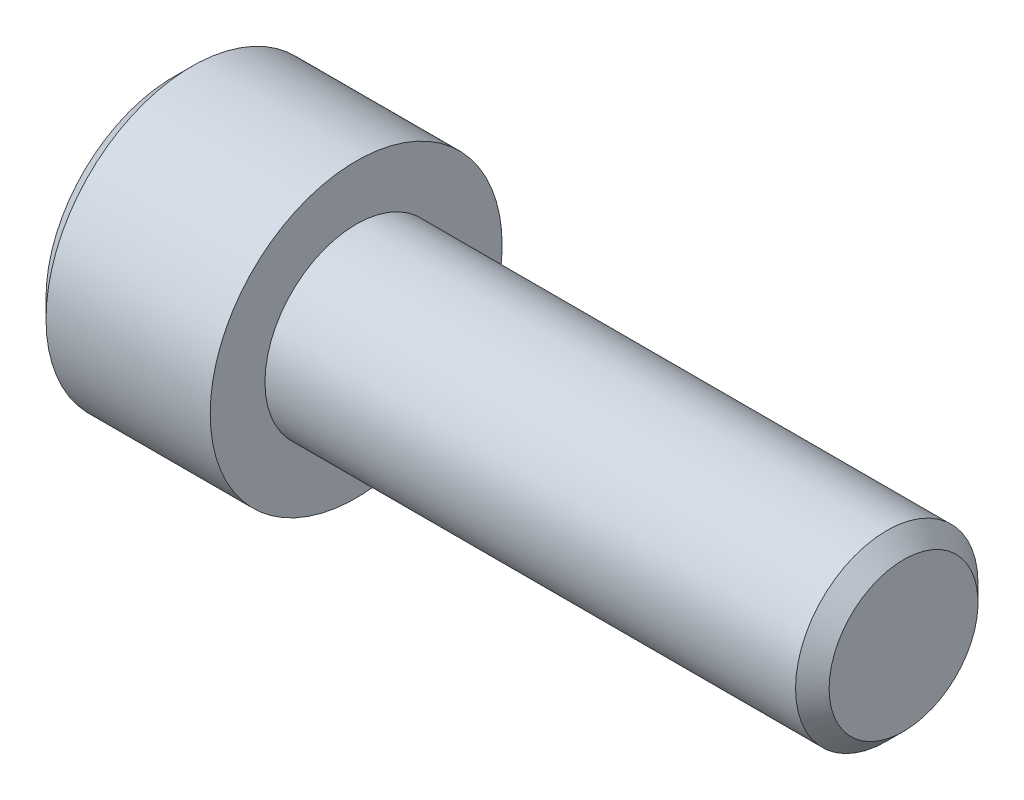
ISO-10303-21;
HEADER;
FILE_DESCRIPTION(('STEP AP214'),'2;1');
FILE_NAME('part.step','',(''),(''),'','','');
FILE_SCHEMA(('AUTOMOTIVE_DESIGN { 1 0 10303 214 1 1 1 1 }'));
ENDSEC;
DATA;
#1=APPLICATION_CONTEXT('core data for automotive mechanical design processes');
#2=APPLICATION_PROTOCOL_DEFINITION('international standard','automotive_design',2000,#1);
#3=PRODUCT_CONTEXT('',#1,'mechanical');
#4=PRODUCT('Part','Part','',(#3));
#5=PRODUCT_RELATED_PRODUCT_CATEGORY('part','',(#4));
#6=PRODUCT_DEFINITION_FORMATION('','',#4);
#7=PRODUCT_DEFINITION_CONTEXT('part definition',#1,'design');
#8=PRODUCT_DEFINITION('design','',#6,#7);
#9=PRODUCT_DEFINITION_SHAPE('','',#8);
#10=(LENGTH_UNIT() NAMED_UNIT(*) SI_UNIT(.MILLI.,.METRE.));
#11=(NAMED_UNIT(*) PLANE_ANGLE_UNIT() SI_UNIT($,.RADIAN.));
#12=(NAMED_UNIT(*) SI_UNIT($,.STERADIAN.) SOLID_ANGLE_UNIT());
#13=UNCERTAINTY_MEASURE_WITH_UNIT(LENGTH_MEASURE(1.E-05),#10,'distance_accuracy_value','');
#14=(GEOMETRIC_REPRESENTATION_CONTEXT(3) GLOBAL_UNCERTAINTY_ASSIGNED_CONTEXT((#13)) GLOBAL_UNIT_ASSIGNED_CONTEXT((#10,
#11,#12)) REPRESENTATION_CONTEXT('',''));
#15=CARTESIAN_POINT('',(0.,0.,0.));
#16=DIRECTION('',(0.,0.,1.));
#17=DIRECTION('',(1.,0.,0.));
#18=AXIS2_PLACEMENT_3D('',#15,#16,#17);
#19=CARTESIAN_POINT('',(-4.99999999993861,0.,0.));
#20=DIRECTION('',(-1.,0.,0.));
#21=DIRECTION('',(0.,0.,1.));
#22=AXIS2_PLACEMENT_3D('',#19,#20,#21);
#23=CONICAL_SURFACE('',#22,3.99999999984857,1.3089969389862);
#24=CARTESIAN_POINT('',(-3.92820323028786,0.,-5.6843418860808E-11));
#25=VERTEX_POINT('',#24);
#26=VERTEX_LOOP('',#25);
#27=FACE_BOUND('',#26,.T.);
#28=CARTESIAN_POINT('',(-4.99999999995384,0.,0.));
#29=DIRECTION('',(-1.,0.,0.));
#30=DIRECTION('',(0.,0.,1.));
#31=AXIS2_PLACEMENT_3D('',#28,#29,#30);
#32=CIRCLE('',#31,3.99999999990541);
#33=CARTESIAN_POINT('',(-4.99999999997692,3.46410161509679,-1.99999999997635));
#34=VERTEX_POINT('',#33);
#35=CARTESIAN_POINT('',(-4.99999999997692,0.,-3.99999999995271));
#36=VERTEX_POINT('',#35);
#37=EDGE_CURVE('E152',#34,#36,#32,.T.);
#38=ORIENTED_EDGE('',*,*,#37,.T.);
#39=CARTESIAN_POINT('',(-4.99999999995384,0.,0.));
#40=DIRECTION('',(-1.,0.,0.));
#41=DIRECTION('',(0.,0.,1.));
#42=AXIS2_PLACEMENT_3D('',#39,#40,#41);
#43=CIRCLE('',#42,3.99999999990541);
#44=CARTESIAN_POINT('',(-4.99999999997692,-3.4641016150968,-1.99999999997636));
#45=VERTEX_POINT('',#44);
#46=EDGE_CURVE('E136',#36,#45,#43,.T.);
#47=ORIENTED_EDGE('',*,*,#46,.T.);
#48=CARTESIAN_POINT('',(-4.99999999995384,0.,0.));
#49=DIRECTION('',(-1.,0.,0.));
#50=DIRECTION('',(0.,0.,1.));
#51=AXIS2_PLACEMENT_3D('',#48,#49,#50);
#52=CIRCLE('',#51,3.99999999990541);
#53=CARTESIAN_POINT('',(-4.99999999997692,-3.4641016150968,1.99999999997635));
#54=VERTEX_POINT('',#53);
#55=EDGE_CURVE('E89',#45,#54,#52,.T.);
#56=ORIENTED_EDGE('',*,*,#55,.T.);
#57=CARTESIAN_POINT('',(-4.99999999995384,0.,0.));
#58=DIRECTION('',(-1.,0.,0.));
#59=DIRECTION('',(0.,0.,1.));
#60=AXIS2_PLACEMENT_3D('',#57,#58,#59);
#61=CIRCLE('',#60,3.99999999990541);
#62=CARTESIAN_POINT('',(-4.99999999997692,0.,3.99999999995271));
#63=VERTEX_POINT('',#62);
#64=EDGE_CURVE('E20',#54,#63,#61,.T.);
#65=ORIENTED_EDGE('',*,*,#64,.T.);
#66=CARTESIAN_POINT('',(-4.99999999995384,0.,0.));
#67=DIRECTION('',(-1.,0.,0.));
#68=DIRECTION('',(0.,0.,1.));
#69=AXIS2_PLACEMENT_3D('',#66,#67,#68);
#70=CIRCLE('',#69,3.99999999990541);
#71=CARTESIAN_POINT('',(-4.99999999997692,3.4641016150968,1.99999999997636));
#72=VERTEX_POINT('',#71);
#73=EDGE_CURVE('E92',#63,#72,#70,.T.);
#74=ORIENTED_EDGE('',*,*,#73,.T.);
#75=CARTESIAN_POINT('',(-4.99999999995384,0.,0.));
#76=DIRECTION('',(-1.,0.,0.));
#77=DIRECTION('',(0.,0.,1.));
#78=AXIS2_PLACEMENT_3D('',#75,#76,#77);
#79=CIRCLE('',#78,3.99999999990541);
#80=EDGE_CURVE('E106',#72,#34,#79,.T.);
#81=ORIENTED_EDGE('',*,*,#80,.T.);
#82=EDGE_LOOP('',(#38,#47,#56,#65,#74,#81));
#83=FACE_BOUND('',#82,.T.);
#84=ADVANCED_FACE('F17',(#27,#83),#23,.F.);
#85=CARTESIAN_POINT('',(-5.,0.,0.));
#86=DIRECTION('',(1.,0.,0.));
#87=DIRECTION('',(0.,0.,-1.));
#88=AXIS2_PLACEMENT_3D('',#85,#86,#87);
#89=PLANE('',#88);
#90=DIRECTION('',(0.,0.5,0.866025403784439));
#91=VECTOR('',#90,1.);
#92=CARTESIAN_POINT('',(-5.,-2.3094010767585,4.));
#93=LINE('',#92,#91);
#94=CARTESIAN_POINT('',(-5.,-2.3094010767585,4.));
#95=VERTEX_POINT('',#94);
#96=EDGE_CURVE('E111',#95,#54,#93,.F.);
#97=ORIENTED_EDGE('',*,*,#96,.F.);
#98=DIRECTION('',(0.,1.,0.));
#99=VECTOR('',#98,1.);
#100=CARTESIAN_POINT('',(-5.,2.3094010767585,4.));
#101=LINE('',#100,#99);
#102=EDGE_CURVE('E108',#63,#95,#101,.F.);
#103=ORIENTED_EDGE('',*,*,#102,.F.);
#104=ORIENTED_EDGE('',*,*,#64,.F.);
#105=EDGE_LOOP('',(#97,#103,#104));
#106=FACE_BOUND('',#105,.T.);
#107=ADVANCED_FACE('F109',(#106),#89,.F.);
#108=CARTESIAN_POINT('',(-5.,0.,0.));
#109=DIRECTION('',(1.,0.,0.));
#110=DIRECTION('',(0.,0.,-1.));
#111=AXIS2_PLACEMENT_3D('',#108,#109,#110);
#112=PLANE('',#111);
#113=DIRECTION('',(0.,1.,0.));
#114=VECTOR('',#113,1.);
#115=CARTESIAN_POINT('',(-5.,2.3094010767585,4.));
#116=LINE('',#115,#114);
#117=CARTESIAN_POINT('',(-5.,2.3094010767585,4.));
#118=VERTEX_POINT('',#117);
#119=EDGE_CURVE('E101',#118,#63,#116,.F.);
#120=ORIENTED_EDGE('',*,*,#119,.F.);
#121=DIRECTION('',(0.,0.5,-0.866025403784439));
#122=VECTOR('',#121,1.);
#123=CARTESIAN_POINT('',(-5.,4.61880215351701,0.));
#124=LINE('',#123,#122);
#125=EDGE_CURVE('E104',#72,#118,#124,.F.);
#126=ORIENTED_EDGE('',*,*,#125,.F.);
#127=ORIENTED_EDGE('',*,*,#73,.F.);
#128=EDGE_LOOP('',(#120,#126,#127));
#129=FACE_BOUND('',#128,.T.);
#130=ADVANCED_FACE('F99',(#129),#112,.F.);
#131=CARTESIAN_POINT('',(-5.,0.,0.));
#132=DIRECTION('',(1.,0.,0.));
#133=DIRECTION('',(0.,0.,-1.));
#134=AXIS2_PLACEMENT_3D('',#131,#132,#133);
#135=PLANE('',#134);
#136=ORIENTED_EDGE('',*,*,#80,.F.);
#137=DIRECTION('',(0.,0.5,-0.866025403784439));
#138=VECTOR('',#137,1.);
#139=CARTESIAN_POINT('',(-5.,4.61880215351701,0.));
#140=LINE('',#139,#138);
#141=CARTESIAN_POINT('',(-5.,4.61880215351701,0.));
#142=VERTEX_POINT('',#141);
#143=EDGE_CURVE('E132',#142,#72,#140,.F.);
#144=ORIENTED_EDGE('',*,*,#143,.F.);
#145=DIRECTION('',(0.,-0.5,-0.866025403784439));
#146=VECTOR('',#145,1.);
#147=CARTESIAN_POINT('',(-5.,2.3094010767585,-4.));
#148=LINE('',#147,#146);
#149=EDGE_CURVE('E168',#34,#142,#148,.F.);
#150=ORIENTED_EDGE('',*,*,#149,.F.);
#151=EDGE_LOOP('',(#136,#144,#150));
#152=FACE_BOUND('',#151,.T.);
#153=ADVANCED_FACE('F169',(#152),#135,.F.);
#154=CARTESIAN_POINT('',(-5.,0.,0.));
#155=DIRECTION('',(1.,0.,0.));
#156=DIRECTION('',(0.,0.,-1.));
#157=AXIS2_PLACEMENT_3D('',#154,#155,#156);
#158=PLANE('',#157);
#159=DIRECTION('',(0.,-0.5,-0.866025403784439));
#160=VECTOR('',#159,1.);
#161=CARTESIAN_POINT('',(-5.,2.3094010767585,-4.));
#162=LINE('',#161,#160);
#163=CARTESIAN_POINT('',(-5.,2.3094010767585,-4.));
#164=VERTEX_POINT('',#163);
#165=EDGE_CURVE('E162',#164,#34,#162,.F.);
#166=ORIENTED_EDGE('',*,*,#165,.F.);
#167=DIRECTION('',(0.,1.,0.));
#168=VECTOR('',#167,1.);
#169=CARTESIAN_POINT('',(-5.,-2.3094010767585,-4.));
#170=LINE('',#169,#168);
#171=EDGE_CURVE('E165',#36,#164,#170,.T.);
#172=ORIENTED_EDGE('',*,*,#171,.F.);
#173=ORIENTED_EDGE('',*,*,#37,.F.);
#174=EDGE_LOOP('',(#166,#172,#173));
#175=FACE_BOUND('',#174,.T.);
#176=ADVANCED_FACE('F160',(#175),#158,.F.);
#177=CARTESIAN_POINT('',(-5.,0.,0.));
#178=DIRECTION('',(1.,0.,0.));
#179=DIRECTION('',(0.,0.,-1.));
#180=AXIS2_PLACEMENT_3D('',#177,#178,#179);
#181=PLANE('',#180);
#182=DIRECTION('',(0.,-0.5,0.866025403784439));
#183=VECTOR('',#182,1.);
#184=CARTESIAN_POINT('',(-5.,-4.61880215351701,0.));
#185=LINE('',#184,#183);
#186=CARTESIAN_POINT('',(-5.,-4.61880215351701,0.));
#187=VERTEX_POINT('',#186);
#188=EDGE_CURVE('E214',#187,#45,#185,.F.);
#189=ORIENTED_EDGE('',*,*,#188,.F.);
#190=DIRECTION('',(0.,0.5,0.866025403784439));
#191=VECTOR('',#190,1.);
#192=CARTESIAN_POINT('',(-5.,-2.3094010767585,4.));
#193=LINE('',#192,#191);
#194=EDGE_CURVE('E120',#54,#187,#193,.F.);
#195=ORIENTED_EDGE('',*,*,#194,.F.);
#196=ORIENTED_EDGE('',*,*,#55,.F.);
#197=EDGE_LOOP('',(#189,#195,#196));
#198=FACE_BOUND('',#197,.T.);
#199=ADVANCED_FACE('F253',(#198),#181,.F.);
#200=CARTESIAN_POINT('',(-5.,0.,0.));
#201=DIRECTION('',(1.,0.,0.));
#202=DIRECTION('',(0.,0.,-1.));
#203=AXIS2_PLACEMENT_3D('',#200,#201,#202);
#204=PLANE('',#203);
#205=DIRECTION('',(0.,1.,0.));
#206=VECTOR('',#205,1.);
#207=CARTESIAN_POINT('',(-5.,-2.3094010767585,-4.));
#208=LINE('',#207,#206);
#209=CARTESIAN_POINT('',(-5.,-2.3094010767585,-4.));
#210=VERTEX_POINT('',#209);
#211=EDGE_CURVE('E187',#210,#36,#208,.T.);
#212=ORIENTED_EDGE('',*,*,#211,.F.);
#213=DIRECTION('',(0.,-0.5,0.866025403784439));
#214=VECTOR('',#213,1.);
#215=CARTESIAN_POINT('',(-5.,-4.61880215351701,0.));
#216=LINE('',#215,#214);
#217=EDGE_CURVE('E217',#45,#210,#216,.F.);
#218=ORIENTED_EDGE('',*,*,#217,.F.);
#219=ORIENTED_EDGE('',*,*,#46,.F.);
#220=EDGE_LOOP('',(#212,#218,#219));
#221=FACE_BOUND('',#220,.T.);
#222=ADVANCED_FACE('F250',(#221),#204,.F.);
#223=CARTESIAN_POINT('',(-5.,-2.3094010767585,4.));
#224=DIRECTION('',(0.,0.866025403784439,-0.5));
#225=DIRECTION('',(0.,0.5,0.866025403784439));
#226=AXIS2_PLACEMENT_3D('',#223,#224,#225);
#227=PLANE('',#226);
#228=ORIENTED_EDGE('',*,*,#194,.T.);
#229=DIRECTION('',(1.,0.,0.));
#230=VECTOR('',#229,1.);
#231=CARTESIAN_POINT('',(-5.,-4.61880215351701,0.));
#232=LINE('',#231,#230);
#233=CARTESIAN_POINT('',(-10.,-4.61880215351701,0.));
#234=VERTEX_POINT('',#233);
#235=EDGE_CURVE('E218',#234,#187,#232,.T.);
#236=ORIENTED_EDGE('',*,*,#235,.F.);
#237=DIRECTION('',(0.,0.500000000000001,0.866025403784438));
#238=VECTOR('',#237,1.);
#239=CARTESIAN_POINT('',(-10.,-4.61880215351701,0.));
#240=LINE('',#239,#238);
#241=CARTESIAN_POINT('',(-10.,-2.3094010767585,4.));
#242=VERTEX_POINT('',#241);
#243=EDGE_CURVE('E213',#234,#242,#240,.T.);
#244=ORIENTED_EDGE('',*,*,#243,.T.);
#245=DIRECTION('',(-1.,0.,0.));
#246=VECTOR('',#245,1.);
#247=CARTESIAN_POINT('',(-5.,-2.3094010767585,4.));
#248=LINE('',#247,#246);
#249=EDGE_CURVE('E115',#95,#242,#248,.T.);
#250=ORIENTED_EDGE('',*,*,#249,.F.);
#251=ORIENTED_EDGE('',*,*,#96,.T.);
#252=EDGE_LOOP('',(#228,#236,#244,#250,#251));
#253=FACE_BOUND('',#252,.T.);
#254=ADVANCED_FACE('F255',(#253),#227,.T.);
#255=CARTESIAN_POINT('',(-5.,2.3094010767585,4.));
#256=DIRECTION('',(0.,0.,-1.));
#257=DIRECTION('',(-1.,0.,0.));
#258=AXIS2_PLACEMENT_3D('',#255,#256,#257);
#259=PLANE('',#258);
#260=ORIENTED_EDGE('',*,*,#102,.T.);
#261=ORIENTED_EDGE('',*,*,#249,.T.);
#262=DIRECTION('',(0.,1.,0.));
#263=VECTOR('',#262,1.);
#264=CARTESIAN_POINT('',(-10.,0.,4.));
#265=LINE('',#264,#263);
#266=CARTESIAN_POINT('',(-10.,2.3094010767585,4.));
#267=VERTEX_POINT('',#266);
#268=EDGE_CURVE('E208',#242,#267,#265,.T.);
#269=ORIENTED_EDGE('',*,*,#268,.T.);
#270=DIRECTION('',(1.,0.,0.));
#271=VECTOR('',#270,1.);
#272=CARTESIAN_POINT('',(-5.,2.30940107675851,4.));
#273=LINE('',#272,#271);
#274=EDGE_CURVE('E119',#118,#267,#273,.F.);
#275=ORIENTED_EDGE('',*,*,#274,.F.);
#276=ORIENTED_EDGE('',*,*,#119,.T.);
#277=EDGE_LOOP('',(#260,#261,#269,#275,#276));
#278=FACE_BOUND('',#277,.T.);
#279=ADVANCED_FACE('F117',(#278),#259,.T.);
#280=CARTESIAN_POINT('',(-5.,4.61880215351701,0.));
#281=DIRECTION('',(0.,-0.866025403784439,-0.5));
#282=DIRECTION('',(0.,0.5,-0.866025403784439));
#283=AXIS2_PLACEMENT_3D('',#280,#281,#282);
#284=PLANE('',#283);
#285=ORIENTED_EDGE('',*,*,#125,.T.);
#286=ORIENTED_EDGE('',*,*,#274,.T.);
#287=DIRECTION('',(0.,0.500000000000001,-0.866025403784438));
#288=VECTOR('',#287,1.);
#289=CARTESIAN_POINT('',(-10.,2.3094010767585,4.));
#290=LINE('',#289,#288);
#291=CARTESIAN_POINT('',(-10.,4.61880215351701,0.));
#292=VERTEX_POINT('',#291);
#293=EDGE_CURVE('E198',#267,#292,#290,.T.);
#294=ORIENTED_EDGE('',*,*,#293,.T.);
#295=DIRECTION('',(1.,0.,0.));
#296=VECTOR('',#295,1.);
#297=CARTESIAN_POINT('',(-5.,4.618802153517,0.));
#298=LINE('',#297,#296);
#299=EDGE_CURVE('E173',#142,#292,#298,.F.);
#300=ORIENTED_EDGE('',*,*,#299,.F.);
#301=ORIENTED_EDGE('',*,*,#143,.T.);
#302=EDGE_LOOP('',(#285,#286,#294,#300,#301));
#303=FACE_BOUND('',#302,.T.);
#304=ADVANCED_FACE('F196',(#303),#284,.T.);
#305=CARTESIAN_POINT('',(-5.,2.3094010767585,-4.));
#306=DIRECTION('',(0.,-0.866025403784439,0.5));
#307=DIRECTION('',(0.,-0.5,-0.866025403784439));
#308=AXIS2_PLACEMENT_3D('',#305,#306,#307);
#309=PLANE('',#308);
#310=ORIENTED_EDGE('',*,*,#149,.T.);
#311=ORIENTED_EDGE('',*,*,#299,.T.);
#312=DIRECTION('',(0.,-0.500000000000001,-0.866025403784438));
#313=VECTOR('',#312,1.);
#314=CARTESIAN_POINT('',(-10.,4.61880215351701,0.));
#315=LINE('',#314,#313);
#316=CARTESIAN_POINT('',(-10.,2.3094010767585,-4.));
#317=VERTEX_POINT('',#316);
#318=EDGE_CURVE('E200',#292,#317,#315,.T.);
#319=ORIENTED_EDGE('',*,*,#318,.T.);
#320=DIRECTION('',(1.,0.,0.));
#321=VECTOR('',#320,1.);
#322=CARTESIAN_POINT('',(-5.,2.3094010767585,-4.));
#323=LINE('',#322,#321);
#324=EDGE_CURVE('E176',#164,#317,#323,.F.);
#325=ORIENTED_EDGE('',*,*,#324,.F.);
#326=ORIENTED_EDGE('',*,*,#165,.T.);
#327=EDGE_LOOP('',(#310,#311,#319,#325,#326));
#328=FACE_BOUND('',#327,.T.);
#329=ADVANCED_FACE('F175',(#328),#309,.T.);
#330=CARTESIAN_POINT('',(-5.,-2.3094010767585,-4.));
#331=DIRECTION('',(0.,0.,1.));
#332=DIRECTION('',(1.,0.,0.));
#333=AXIS2_PLACEMENT_3D('',#330,#331,#332);
#334=PLANE('',#333);
#335=ORIENTED_EDGE('',*,*,#171,.T.);
#336=ORIENTED_EDGE('',*,*,#324,.T.);
#337=DIRECTION('',(0.,1.,0.));
#338=VECTOR('',#337,1.);
#339=CARTESIAN_POINT('',(-10.,0.,-4.));
#340=LINE('',#339,#338);
#341=CARTESIAN_POINT('',(-10.,-2.3094010767585,-4.));
#342=VERTEX_POINT('',#341);
#343=EDGE_CURVE('E35',#317,#342,#340,.F.);
#344=ORIENTED_EDGE('',*,*,#343,.T.);
#345=DIRECTION('',(1.,0.,0.));
#346=VECTOR('',#345,1.);
#347=CARTESIAN_POINT('',(-5.,-2.30940107675851,-4.));
#348=LINE('',#347,#346);
#349=EDGE_CURVE('E223',#210,#342,#348,.F.);
#350=ORIENTED_EDGE('',*,*,#349,.F.);
#351=ORIENTED_EDGE('',*,*,#211,.T.);
#352=EDGE_LOOP('',(#335,#336,#344,#350,#351));
#353=FACE_BOUND('',#352,.T.);
#354=ADVANCED_FACE('F247',(#353),#334,.T.);
#355=CARTESIAN_POINT('',(-5.,-4.61880215351701,0.));
#356=DIRECTION('',(0.,0.866025403784439,0.5));
#357=DIRECTION('',(0.,-0.5,0.866025403784439));
#358=AXIS2_PLACEMENT_3D('',#355,#356,#357);
#359=PLANE('',#358);
#360=ORIENTED_EDGE('',*,*,#217,.T.);
#361=ORIENTED_EDGE('',*,*,#349,.T.);
#362=DIRECTION('',(0.,-0.500000000000001,0.866025403784438));
#363=VECTOR('',#362,1.);
#364=CARTESIAN_POINT('',(-10.,-2.3094010767585,-4.));
#365=LINE('',#364,#363);
#366=EDGE_CURVE('E149',#342,#234,#365,.T.);
#367=ORIENTED_EDGE('',*,*,#366,.T.);
#368=ORIENTED_EDGE('',*,*,#235,.T.);
#369=ORIENTED_EDGE('',*,*,#188,.T.);
#370=EDGE_LOOP('',(#360,#361,#367,#368,#369));
#371=FACE_BOUND('',#370,.T.);
#372=ADVANCED_FACE('F258',(#371),#359,.T.);
#373=CARTESIAN_POINT('',(-10.,0.,0.));
#374=DIRECTION('',(1.,0.,0.));
#375=DIRECTION('',(0.,0.,-1.));
#376=AXIS2_PLACEMENT_3D('',#373,#374,#375);
#377=PLANE('',#376);
#378=ORIENTED_EDGE('',*,*,#343,.F.);
#379=ORIENTED_EDGE('',*,*,#318,.F.);
#380=ORIENTED_EDGE('',*,*,#293,.F.);
#381=ORIENTED_EDGE('',*,*,#268,.F.);
#382=ORIENTED_EDGE('',*,*,#243,.F.);
#383=ORIENTED_EDGE('',*,*,#366,.F.);
#384=EDGE_LOOP('',(#378,#379,#380,#381,#382,#383));
#385=FACE_BOUND('',#384,.T.);
#386=CARTESIAN_POINT('',(-10.,0.,0.));
#387=DIRECTION('',(1.,0.,0.));
#388=DIRECTION('',(0.,0.,-1.));
#389=AXIS2_PLACEMENT_3D('',#386,#387,#388);
#390=CIRCLE('',#389,7.);
#391=CARTESIAN_POINT('',(-10.,0.,-7.));
#392=VERTEX_POINT('',#391);
#393=EDGE_CURVE('E146',#392,#392,#390,.T.);
#394=ORIENTED_EDGE('',*,*,#393,.F.);
#395=EDGE_LOOP('',(#394));
#396=FACE_BOUND('',#395,.T.);
#397=ADVANCED_FACE('F202',(#385,#396),#377,.F.);
#398=CARTESIAN_POINT('',(-9.00000000000255,0.,0.));
#399=DIRECTION('',(1.,0.,0.));
#400=DIRECTION('',(0.,0.,-1.));
#401=AXIS2_PLACEMENT_3D('',#398,#399,#400);
#402=CONICAL_SURFACE('',#401,8.00000000000255,0.785398163400001);
#403=ORIENTED_EDGE('',*,*,#393,.T.);
#404=EDGE_LOOP('',(#403));
#405=FACE_BOUND('',#404,.T.);
#406=CARTESIAN_POINT('',(-9.,0.,0.));
#407=DIRECTION('',(-1.,0.,0.));
#408=DIRECTION('',(0.,0.,1.));
#409=AXIS2_PLACEMENT_3D('',#406,#407,#408);
#410=CIRCLE('',#409,8.);
#411=CARTESIAN_POINT('',(-9.,0.,8.));
#412=VERTEX_POINT('',#411);
#413=EDGE_CURVE('E145',#412,#412,#410,.F.);
#414=ORIENTED_EDGE('',*,*,#413,.F.);
#415=EDGE_LOOP('',(#414));
#416=FACE_BOUND('',#415,.T.);
#417=ADVANCED_FACE('F266',(#405,#416),#402,.T.);
#418=CARTESIAN_POINT('',(30.,4.08,0.));
#419=DIRECTION('',(-1.,0.,0.));
#420=DIRECTION('',(0.,0.,1.));
#421=AXIS2_PLACEMENT_3D('',#418,#419,#420);
#422=PLANE('',#421);
#423=CARTESIAN_POINT('',(29.9999999999727,0.,0.));
#424=DIRECTION('',(-1.,0.,0.));
#425=DIRECTION('',(0.,0.,1.));
#426=AXIS2_PLACEMENT_3D('',#423,#424,#425);
#427=CIRCLE('',#426,4.07999999998765);
#428=CARTESIAN_POINT('',(29.9999999999727,0.,4.07999999998765));
#429=VERTEX_POINT('',#428);
#430=EDGE_CURVE('E142',#429,#429,#427,.T.);
#431=ORIENTED_EDGE('',*,*,#430,.F.);
#432=EDGE_LOOP('',(#431));
#433=FACE_BOUND('',#432,.T.);
#434=ADVANCED_FACE('F288',(#433),#422,.F.);
#435=CARTESIAN_POINT('',(30.,0.,0.));
#436=DIRECTION('',(-1.,0.,0.));
#437=DIRECTION('',(0.,0.,1.));
#438=AXIS2_PLACEMENT_3D('',#435,#436,#437);
#439=CYLINDRICAL_SURFACE('',#438,8.);
#440=ORIENTED_EDGE('',*,*,#413,.T.);
#441=EDGE_LOOP('',(#440));
#442=FACE_BOUND('',#441,.T.);
#443=CARTESIAN_POINT('',(0.,0.,0.));
#444=DIRECTION('',(-1.,0.,0.));
#445=DIRECTION('',(0.,0.,1.));
#446=AXIS2_PLACEMENT_3D('',#443,#444,#445);
#447=CIRCLE('',#446,8.);
#448=CARTESIAN_POINT('',(0.,0.,8.));
#449=VERTEX_POINT('',#448);
#450=EDGE_CURVE('E139',#449,#449,#447,.T.);
#451=ORIENTED_EDGE('',*,*,#450,.T.);
#452=EDGE_LOOP('',(#451));
#453=FACE_BOUND('',#452,.T.);
#454=ADVANCED_FACE('F284',(#442,#453),#439,.T.);
#455=CARTESIAN_POINT('',(29.0799999999081,0.,0.));
#456=DIRECTION('',(-1.,0.,0.));
#457=DIRECTION('',(0.,0.,1.));
#458=AXIS2_PLACEMENT_3D('',#455,#456,#457);
#459=CONICAL_SURFACE('',#458,5.0000000000523,0.785398163397448);
#460=CARTESIAN_POINT('',(29.08,0.,0.));
#461=DIRECTION('',(-1.,0.,0.));
#462=DIRECTION('',(0.,0.,1.));
#463=AXIS2_PLACEMENT_3D('',#460,#461,#462);
#464=CIRCLE('',#463,5.);
#465=CARTESIAN_POINT('',(29.08,0.,5.));
#466=VERTEX_POINT('',#465);
#467=EDGE_CURVE('E26',#466,#466,#464,.T.);
#468=ORIENTED_EDGE('',*,*,#467,.F.);
#469=EDGE_LOOP('',(#468));
#470=FACE_BOUND('',#469,.T.);
#471=ORIENTED_EDGE('',*,*,#430,.T.);
#472=EDGE_LOOP('',(#471));
#473=FACE_BOUND('',#472,.T.);
#474=ADVANCED_FACE('F277',(#470,#473),#459,.T.);
#475=CARTESIAN_POINT('',(0.,8.,0.));
#476=DIRECTION('',(-1.,0.,0.));
#477=DIRECTION('',(0.,0.,1.));
#478=AXIS2_PLACEMENT_3D('',#475,#476,#477);
#479=PLANE('',#478);
#480=ORIENTED_EDGE('',*,*,#450,.F.);
#481=EDGE_LOOP('',(#480));
#482=FACE_BOUND('',#481,.T.);
#483=CARTESIAN_POINT('',(0.,0.,0.));
#484=DIRECTION('',(-1.,0.,0.));
#485=DIRECTION('',(0.,0.,1.));
#486=AXIS2_PLACEMENT_3D('',#483,#484,#485);
#487=CIRCLE('',#486,5.);
#488=CARTESIAN_POINT('',(0.,0.,5.));
#489=VERTEX_POINT('',#488);
#490=EDGE_CURVE('E11',#489,#489,#487,.F.);
#491=ORIENTED_EDGE('',*,*,#490,.F.);
#492=EDGE_LOOP('',(#491));
#493=FACE_BOUND('',#492,.T.);
#494=ADVANCED_FACE('F271',(#482,#493),#479,.F.);
#495=CARTESIAN_POINT('',(30.,0.,0.));
#496=DIRECTION('',(-1.,0.,0.));
#497=DIRECTION('',(0.,0.,1.));
#498=AXIS2_PLACEMENT_3D('',#495,#496,#497);
#499=CYLINDRICAL_SURFACE('',#498,5.);
#500=ORIENTED_EDGE('',*,*,#490,.T.);
#501=EDGE_LOOP('',(#500));
#502=FACE_BOUND('',#501,.T.);
#503=ORIENTED_EDGE('',*,*,#467,.T.);
#504=EDGE_LOOP('',(#503));
#505=FACE_BOUND('',#504,.T.);
#506=ADVANCED_FACE('F269',(#502,#505),#499,.T.);
#507=CLOSED_SHELL('',(#84,#107,#130,#153,#176,#199,#222,#254,#279,#304,#329,#354,#372,#397,#417,
#434,#454,#474,#494,#506));
#508=MANIFOLD_SOLID_BREP('B1',#507);
#509=ADVANCED_BREP_SHAPE_REPRESENTATION('',(#18,#508),#14);
#510=SHAPE_DEFINITION_REPRESENTATION(#9,#509);
ENDSEC;
END-ISO-10303-21;
